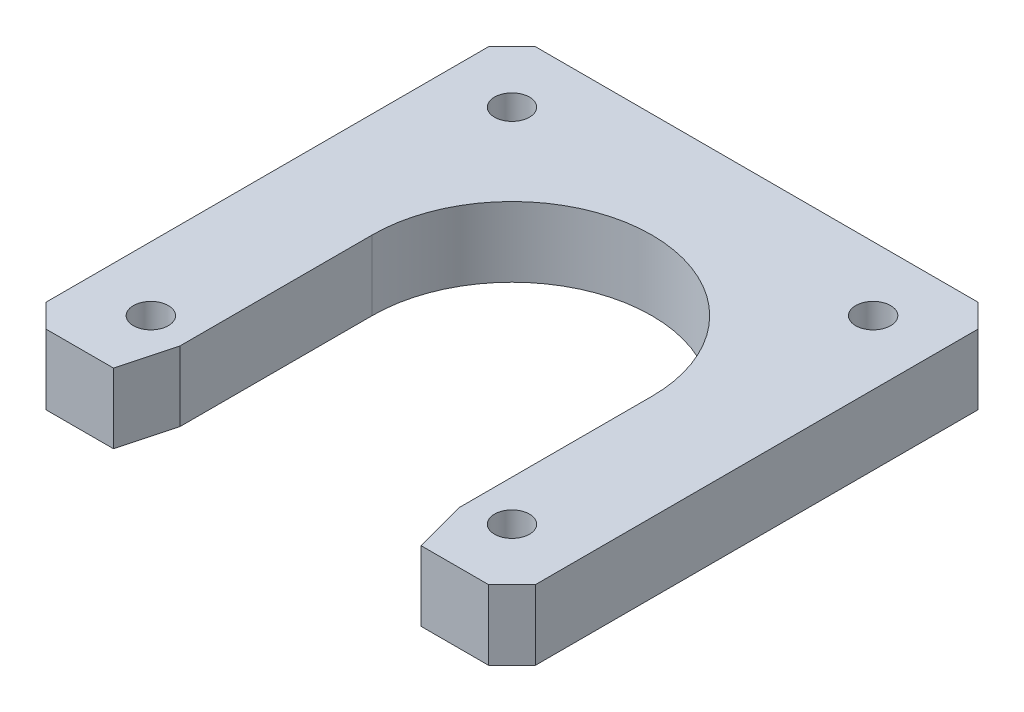
ISO-10303-21;
HEADER;
FILE_DESCRIPTION(('STEP AP214'),'2;1');
FILE_NAME('part.step','',(''),(''),'','','');
FILE_SCHEMA(('AUTOMOTIVE_DESIGN { 1 0 10303 214 1 1 1 1 }'));
ENDSEC;
DATA;
#1=APPLICATION_CONTEXT('core data for automotive mechanical design processes');
#2=APPLICATION_PROTOCOL_DEFINITION('international standard','automotive_design',2000,#1);
#3=PRODUCT_CONTEXT('',#1,'mechanical');
#4=PRODUCT('Part','Part','',(#3));
#5=PRODUCT_RELATED_PRODUCT_CATEGORY('part','',(#4));
#6=PRODUCT_DEFINITION_FORMATION('','',#4);
#7=PRODUCT_DEFINITION_CONTEXT('part definition',#1,'design');
#8=PRODUCT_DEFINITION('design','',#6,#7);
#9=PRODUCT_DEFINITION_SHAPE('','',#8);
#10=(LENGTH_UNIT() NAMED_UNIT(*) SI_UNIT(.MILLI.,.METRE.));
#11=(NAMED_UNIT(*) PLANE_ANGLE_UNIT() SI_UNIT($,.RADIAN.));
#12=(NAMED_UNIT(*) SI_UNIT($,.STERADIAN.) SOLID_ANGLE_UNIT());
#13=UNCERTAINTY_MEASURE_WITH_UNIT(LENGTH_MEASURE(1.E-05),#10,'distance_accuracy_value','');
#14=(GEOMETRIC_REPRESENTATION_CONTEXT(3) GLOBAL_UNCERTAINTY_ASSIGNED_CONTEXT((#13)) GLOBAL_UNIT_ASSIGNED_CONTEXT((#10,
#11,#12)) REPRESENTATION_CONTEXT('',''));
#15=CARTESIAN_POINT('',(0.,0.,0.));
#16=DIRECTION('',(0.,0.,1.));
#17=DIRECTION('',(1.,0.,0.));
#18=AXIS2_PLACEMENT_3D('',#15,#16,#17);
#19=CARTESIAN_POINT('',(-21.,6.,21.));
#20=DIRECTION('',(0.,0.,-1.));
#21=DIRECTION('',(-1.,0.,0.));
#22=AXIS2_PLACEMENT_3D('',#19,#20,#21);
#23=PLANE('',#22);
#24=DIRECTION('',(1.,0.,0.));
#25=VECTOR('',#24,1.);
#26=CARTESIAN_POINT('',(-21.,6.,21.));
#27=LINE('',#26,#25);
#28=CARTESIAN_POINT('',(13.20577136594,6.,21.));
#29=VERTEX_POINT('',#28);
#30=CARTESIAN_POINT('',(19.,6.,21.));
#31=VERTEX_POINT('',#30);
#32=EDGE_CURVE('E181',#29,#31,#27,.T.);
#33=ORIENTED_EDGE('',*,*,#32,.F.);
#34=DIRECTION('',(0.,-1.,0.));
#35=VECTOR('',#34,1.);
#36=CARTESIAN_POINT('',(13.2057713659401,6.,21.));
#37=LINE('',#36,#35);
#38=CARTESIAN_POINT('',(13.2057713659401,0.,21.));
#39=VERTEX_POINT('',#38);
#40=EDGE_CURVE('E239',#29,#39,#37,.T.);
#41=ORIENTED_EDGE('',*,*,#40,.T.);
#42=DIRECTION('',(1.,0.,0.));
#43=VECTOR('',#42,1.);
#44=CARTESIAN_POINT('',(-21.,0.,21.));
#45=LINE('',#44,#43);
#46=CARTESIAN_POINT('',(19.,0.,21.));
#47=VERTEX_POINT('',#46);
#48=EDGE_CURVE('E194',#39,#47,#45,.T.);
#49=ORIENTED_EDGE('',*,*,#48,.T.);
#50=DIRECTION('',(0.,1.,0.));
#51=VECTOR('',#50,1.);
#52=CARTESIAN_POINT('',(19.,6.,21.));
#53=LINE('',#52,#51);
#54=EDGE_CURVE('E230',#47,#31,#53,.T.);
#55=ORIENTED_EDGE('',*,*,#54,.T.);
#56=EDGE_LOOP('',(#33,#41,#49,#55));
#57=FACE_BOUND('',#56,.T.);
#58=ADVANCED_FACE('F34',(#57),#23,.F.);
#59=CARTESIAN_POINT('',(0.,6.,0.));
#60=DIRECTION('',(0.,-1.,0.));
#61=DIRECTION('',(0.,0.,-1.));
#62=AXIS2_PLACEMENT_3D('',#59,#60,#61);
#63=PLANE('',#62);
#64=DIRECTION('',(0.,0.,-1.));
#65=VECTOR('',#64,1.);
#66=CARTESIAN_POINT('',(12.,6.,21.));
#67=LINE('',#66,#65);
#68=CARTESIAN_POINT('',(12.,6.,16.4999999999999));
#69=VERTEX_POINT('',#68);
#70=CARTESIAN_POINT('',(12.,6.,0.));
#71=VERTEX_POINT('',#70);
#72=EDGE_CURVE('E153',#69,#71,#67,.T.);
#73=ORIENTED_EDGE('',*,*,#72,.F.);
#74=DIRECTION('',(-0.258819045102518,0.,-0.965925826289069));
#75=VECTOR('',#74,1.);
#76=CARTESIAN_POINT('',(12.,6.,16.4999999999999));
#77=LINE('',#76,#75);
#78=EDGE_CURVE('E237',#69,#29,#77,.F.);
#79=ORIENTED_EDGE('',*,*,#78,.T.);
#80=ORIENTED_EDGE('',*,*,#32,.T.);
#81=DIRECTION('',(-0.707106781186549,0.,0.707106781186546));
#82=VECTOR('',#81,1.);
#83=CARTESIAN_POINT('',(21.,6.,18.9999999999999));
#84=LINE('',#83,#82);
#85=CARTESIAN_POINT('',(21.,6.,18.9999999999999));
#86=VERTEX_POINT('',#85);
#87=EDGE_CURVE('E216',#31,#86,#84,.F.);
#88=ORIENTED_EDGE('',*,*,#87,.T.);
#89=DIRECTION('',(0.,0.,-1.));
#90=VECTOR('',#89,1.);
#91=CARTESIAN_POINT('',(21.,6.,21.));
#92=LINE('',#91,#90);
#93=CARTESIAN_POINT('',(21.,6.,-18.9999999999999));
#94=VERTEX_POINT('',#93);
#95=EDGE_CURVE('E171',#86,#94,#92,.T.);
#96=ORIENTED_EDGE('',*,*,#95,.T.);
#97=DIRECTION('',(0.707106781186546,0.,0.707106781186549));
#98=VECTOR('',#97,1.);
#99=CARTESIAN_POINT('',(19.,6.,-21.));
#100=LINE('',#99,#98);
#101=CARTESIAN_POINT('',(19.,6.,-21.));
#102=VERTEX_POINT('',#101);
#103=EDGE_CURVE('E218',#94,#102,#100,.F.);
#104=ORIENTED_EDGE('',*,*,#103,.T.);
#105=DIRECTION('',(-1.,0.,0.));
#106=VECTOR('',#105,1.);
#107=CARTESIAN_POINT('',(-21.,6.,-21.));
#108=LINE('',#107,#106);
#109=CARTESIAN_POINT('',(-19.,6.,-21.));
#110=VERTEX_POINT('',#109);
#111=EDGE_CURVE('E174',#102,#110,#108,.T.);
#112=ORIENTED_EDGE('',*,*,#111,.T.);
#113=DIRECTION('',(0.707106781186548,0.,-0.707106781186547));
#114=VECTOR('',#113,1.);
#115=CARTESIAN_POINT('',(-21.,6.,-19.));
#116=LINE('',#115,#114);
#117=CARTESIAN_POINT('',(-21.,6.,-19.));
#118=VERTEX_POINT('',#117);
#119=EDGE_CURVE('E220',#110,#118,#116,.F.);
#120=ORIENTED_EDGE('',*,*,#119,.T.);
#121=DIRECTION('',(0.,0.,1.));
#122=VECTOR('',#121,1.);
#123=CARTESIAN_POINT('',(-21.,6.,21.));
#124=LINE('',#123,#122);
#125=CARTESIAN_POINT('',(-21.,6.,18.9999999999999));
#126=VERTEX_POINT('',#125);
#127=EDGE_CURVE('E178',#118,#126,#124,.T.);
#128=ORIENTED_EDGE('',*,*,#127,.T.);
#129=DIRECTION('',(-0.707106781186546,0.,-0.707106781186549));
#130=VECTOR('',#129,1.);
#131=CARTESIAN_POINT('',(-19.,6.,21.));
#132=LINE('',#131,#130);
#133=CARTESIAN_POINT('',(-19.,6.,21.));
#134=VERTEX_POINT('',#133);
#135=EDGE_CURVE('E214',#126,#134,#132,.F.);
#136=ORIENTED_EDGE('',*,*,#135,.T.);
#137=CARTESIAN_POINT('',(-13.2057713659401,6.,21.));
#138=VERTEX_POINT('',#137);
#139=EDGE_CURVE('E182',#134,#138,#27,.T.);
#140=ORIENTED_EDGE('',*,*,#139,.T.);
#141=DIRECTION('',(-0.258819045102518,0.,0.965925826289069));
#142=VECTOR('',#141,1.);
#143=CARTESIAN_POINT('',(-13.2057713659401,6.,21.));
#144=LINE('',#143,#142);
#145=CARTESIAN_POINT('',(-12.,6.,16.4999999999999));
#146=VERTEX_POINT('',#145);
#147=EDGE_CURVE('E235',#138,#146,#144,.F.);
#148=ORIENTED_EDGE('',*,*,#147,.T.);
#149=DIRECTION('',(0.,0.,1.));
#150=VECTOR('',#149,1.);
#151=CARTESIAN_POINT('',(-12.,6.,0.));
#152=LINE('',#151,#150);
#153=CARTESIAN_POINT('',(-12.,6.,0.));
#154=VERTEX_POINT('',#153);
#155=EDGE_CURVE('E289',#154,#146,#152,.T.);
#156=ORIENTED_EDGE('',*,*,#155,.F.);
#157=CARTESIAN_POINT('',(0.,6.,0.));
#158=DIRECTION('',(0.,1.,0.));
#159=DIRECTION('',(0.,0.,1.));
#160=AXIS2_PLACEMENT_3D('',#157,#158,#159);
#161=CIRCLE('',#160,12.);
#162=EDGE_CURVE('E161',#71,#154,#161,.T.);
#163=ORIENTED_EDGE('',*,*,#162,.F.);
#164=EDGE_LOOP('',(#73,#79,#80,#88,#96,#104,#112,#120,#128,#136,#140,#148,#156,#163));
#165=FACE_BOUND('',#164,.T.);
#166=CARTESIAN_POINT('',(-15.5,6.,-15.5));
#167=DIRECTION('',(0.,1.,0.));
#168=DIRECTION('',(0.,0.,1.));
#169=AXIS2_PLACEMENT_3D('',#166,#167,#168);
#170=CIRCLE('',#169,1.5);
#171=CARTESIAN_POINT('',(-15.5,6.,-14.));
#172=VERTEX_POINT('',#171);
#173=EDGE_CURVE('E162',#172,#172,#170,.T.);
#174=ORIENTED_EDGE('',*,*,#173,.F.);
#175=EDGE_LOOP('',(#174));
#176=FACE_BOUND('',#175,.T.);
#177=CARTESIAN_POINT('',(15.5,6.,-15.5));
#178=DIRECTION('',(0.,1.,0.));
#179=DIRECTION('',(0.,0.,1.));
#180=AXIS2_PLACEMENT_3D('',#177,#178,#179);
#181=CIRCLE('',#180,1.5);
#182=CARTESIAN_POINT('',(15.5,6.,-14.));
#183=VERTEX_POINT('',#182);
#184=EDGE_CURVE('E307',#183,#183,#181,.T.);
#185=ORIENTED_EDGE('',*,*,#184,.F.);
#186=EDGE_LOOP('',(#185));
#187=FACE_BOUND('',#186,.T.);
#188=CARTESIAN_POINT('',(15.5,6.,15.5));
#189=DIRECTION('',(0.,1.,0.));
#190=DIRECTION('',(0.,0.,1.));
#191=AXIS2_PLACEMENT_3D('',#188,#189,#190);
#192=CIRCLE('',#191,1.5);
#193=CARTESIAN_POINT('',(15.5,6.,17.));
#194=VERTEX_POINT('',#193);
#195=EDGE_CURVE('E301',#194,#194,#192,.T.);
#196=ORIENTED_EDGE('',*,*,#195,.F.);
#197=EDGE_LOOP('',(#196));
#198=FACE_BOUND('',#197,.T.);
#199=CARTESIAN_POINT('',(-15.5,6.,15.5));
#200=DIRECTION('',(0.,1.,0.));
#201=DIRECTION('',(0.,0.,1.));
#202=AXIS2_PLACEMENT_3D('',#199,#200,#201);
#203=CIRCLE('',#202,1.5);
#204=CARTESIAN_POINT('',(-15.5,6.,17.));
#205=VERTEX_POINT('',#204);
#206=EDGE_CURVE('E295',#205,#205,#203,.T.);
#207=ORIENTED_EDGE('',*,*,#206,.F.);
#208=EDGE_LOOP('',(#207));
#209=FACE_BOUND('',#208,.T.);
#210=ADVANCED_FACE('F250',(#165,#176,#187,#198,#209),#63,.F.);
#211=CARTESIAN_POINT('',(0.,0.,0.));
#212=DIRECTION('',(0.,-1.,0.));
#213=DIRECTION('',(0.,0.,-1.));
#214=AXIS2_PLACEMENT_3D('',#211,#212,#213);
#215=PLANE('',#214);
#216=ORIENTED_EDGE('',*,*,#48,.F.);
#217=DIRECTION('',(0.258819045102518,0.,0.965925826289069));
#218=VECTOR('',#217,1.);
#219=CARTESIAN_POINT('',(7.07115242270671,0.,-1.89470958122162));
#220=LINE('',#219,#218);
#221=CARTESIAN_POINT('',(12.,0.,16.5));
#222=VERTEX_POINT('',#221);
#223=EDGE_CURVE('E142',#39,#222,#220,.F.);
#224=ORIENTED_EDGE('',*,*,#223,.T.);
#225=DIRECTION('',(0.,0.,-1.));
#226=VECTOR('',#225,1.);
#227=CARTESIAN_POINT('',(12.,0.,21.));
#228=LINE('',#227,#226);
#229=CARTESIAN_POINT('',(12.,0.,0.));
#230=VERTEX_POINT('',#229);
#231=EDGE_CURVE('E134',#222,#230,#228,.T.);
#232=ORIENTED_EDGE('',*,*,#231,.T.);
#233=CARTESIAN_POINT('',(0.,0.,0.));
#234=DIRECTION('',(0.,1.,0.));
#235=DIRECTION('',(0.,0.,1.));
#236=AXIS2_PLACEMENT_3D('',#233,#234,#235);
#237=CIRCLE('',#236,12.);
#238=CARTESIAN_POINT('',(-12.,0.,0.));
#239=VERTEX_POINT('',#238);
#240=EDGE_CURVE('E140',#230,#239,#237,.T.);
#241=ORIENTED_EDGE('',*,*,#240,.T.);
#242=DIRECTION('',(0.,0.,1.));
#243=VECTOR('',#242,1.);
#244=CARTESIAN_POINT('',(-12.,0.,0.));
#245=LINE('',#244,#243);
#246=CARTESIAN_POINT('',(-12.,0.,16.4999999999999));
#247=VERTEX_POINT('',#246);
#248=EDGE_CURVE('E147',#239,#247,#245,.T.);
#249=ORIENTED_EDGE('',*,*,#248,.T.);
#250=DIRECTION('',(0.258819045102518,0.,-0.965925826289069));
#251=VECTOR('',#250,1.);
#252=CARTESIAN_POINT('',(-7.07115242270671,0.,-1.89470958122162));
#253=LINE('',#252,#251);
#254=CARTESIAN_POINT('',(-13.2057713659401,0.,21.));
#255=VERTEX_POINT('',#254);
#256=EDGE_CURVE('E49',#247,#255,#253,.F.);
#257=ORIENTED_EDGE('',*,*,#256,.T.);
#258=CARTESIAN_POINT('',(-19.,0.,21.));
#259=VERTEX_POINT('',#258);
#260=EDGE_CURVE('E175',#259,#255,#45,.T.);
#261=ORIENTED_EDGE('',*,*,#260,.F.);
#262=DIRECTION('',(0.707106781186546,0.,0.707106781186549));
#263=VECTOR('',#262,1.);
#264=CARTESIAN_POINT('',(-20.,0.,19.9999999999999));
#265=LINE('',#264,#263);
#266=CARTESIAN_POINT('',(-21.,0.,18.9999999999999));
#267=VERTEX_POINT('',#266);
#268=EDGE_CURVE('E200',#259,#267,#265,.F.);
#269=ORIENTED_EDGE('',*,*,#268,.T.);
#270=DIRECTION('',(0.,0.,1.));
#271=VECTOR('',#270,1.);
#272=CARTESIAN_POINT('',(-21.,0.,21.));
#273=LINE('',#272,#271);
#274=CARTESIAN_POINT('',(-21.,0.,-19.));
#275=VERTEX_POINT('',#274);
#276=EDGE_CURVE('E191',#275,#267,#273,.T.);
#277=ORIENTED_EDGE('',*,*,#276,.F.);
#278=DIRECTION('',(-0.707106781186548,0.,0.707106781186547));
#279=VECTOR('',#278,1.);
#280=CARTESIAN_POINT('',(-20.,0.,-20.));
#281=LINE('',#280,#279);
#282=CARTESIAN_POINT('',(-19.,0.,-21.));
#283=VERTEX_POINT('',#282);
#284=EDGE_CURVE('E207',#275,#283,#281,.F.);
#285=ORIENTED_EDGE('',*,*,#284,.T.);
#286=DIRECTION('',(-1.,0.,0.));
#287=VECTOR('',#286,1.);
#288=CARTESIAN_POINT('',(-21.,0.,-21.));
#289=LINE('',#288,#287);
#290=CARTESIAN_POINT('',(19.,0.,-21.));
#291=VERTEX_POINT('',#290);
#292=EDGE_CURVE('E188',#291,#283,#289,.T.);
#293=ORIENTED_EDGE('',*,*,#292,.F.);
#294=DIRECTION('',(-0.707106781186546,0.,-0.707106781186549));
#295=VECTOR('',#294,1.);
#296=CARTESIAN_POINT('',(20.,0.,-20.));
#297=LINE('',#296,#295);
#298=CARTESIAN_POINT('',(21.,0.,-19.));
#299=VERTEX_POINT('',#298);
#300=EDGE_CURVE('E205',#291,#299,#297,.F.);
#301=ORIENTED_EDGE('',*,*,#300,.T.);
#302=DIRECTION('',(0.,0.,-1.));
#303=VECTOR('',#302,1.);
#304=CARTESIAN_POINT('',(21.,0.,21.));
#305=LINE('',#304,#303);
#306=CARTESIAN_POINT('',(21.,0.,19.));
#307=VERTEX_POINT('',#306);
#308=EDGE_CURVE('E164',#307,#299,#305,.T.);
#309=ORIENTED_EDGE('',*,*,#308,.F.);
#310=DIRECTION('',(0.707106781186549,0.,-0.707106781186546));
#311=VECTOR('',#310,1.);
#312=CARTESIAN_POINT('',(19.9999999999999,0.,20.));
#313=LINE('',#312,#311);
#314=EDGE_CURVE('E202',#307,#47,#313,.F.);
#315=ORIENTED_EDGE('',*,*,#314,.T.);
#316=EDGE_LOOP('',(#216,#224,#232,#241,#249,#257,#261,#269,#277,#285,#293,#301,#309,#315));
#317=FACE_BOUND('',#316,.T.);
#318=CARTESIAN_POINT('',(15.5,0.,15.5));
#319=DIRECTION('',(0.,1.,0.));
#320=DIRECTION('',(0.,0.,1.));
#321=AXIS2_PLACEMENT_3D('',#318,#319,#320);
#322=CIRCLE('',#321,1.5);
#323=CARTESIAN_POINT('',(15.5,0.,17.));
#324=VERTEX_POINT('',#323);
#325=EDGE_CURVE('E298',#324,#324,#322,.T.);
#326=ORIENTED_EDGE('',*,*,#325,.T.);
#327=EDGE_LOOP('',(#326));
#328=FACE_BOUND('',#327,.T.);
#329=CARTESIAN_POINT('',(-15.5,0.,-15.5));
#330=DIRECTION('',(0.,1.,0.));
#331=DIRECTION('',(0.,0.,1.));
#332=AXIS2_PLACEMENT_3D('',#329,#330,#331);
#333=CIRCLE('',#332,1.5);
#334=CARTESIAN_POINT('',(-15.5,0.,-14.));
#335=VERTEX_POINT('',#334);
#336=EDGE_CURVE('E167',#335,#335,#333,.T.);
#337=ORIENTED_EDGE('',*,*,#336,.T.);
#338=EDGE_LOOP('',(#337));
#339=FACE_BOUND('',#338,.T.);
#340=CARTESIAN_POINT('',(15.5,0.,-15.5));
#341=DIRECTION('',(0.,1.,0.));
#342=DIRECTION('',(0.,0.,1.));
#343=AXIS2_PLACEMENT_3D('',#340,#341,#342);
#344=CIRCLE('',#343,1.5);
#345=CARTESIAN_POINT('',(15.5,0.,-14.));
#346=VERTEX_POINT('',#345);
#347=EDGE_CURVE('E304',#346,#346,#344,.T.);
#348=ORIENTED_EDGE('',*,*,#347,.T.);
#349=EDGE_LOOP('',(#348));
#350=FACE_BOUND('',#349,.T.);
#351=CARTESIAN_POINT('',(-15.5,0.,15.5));
#352=DIRECTION('',(0.,1.,0.));
#353=DIRECTION('',(0.,0.,1.));
#354=AXIS2_PLACEMENT_3D('',#351,#352,#353);
#355=CIRCLE('',#354,1.5);
#356=CARTESIAN_POINT('',(-15.5,0.,17.));
#357=VERTEX_POINT('',#356);
#358=EDGE_CURVE('E157',#357,#357,#355,.T.);
#359=ORIENTED_EDGE('',*,*,#358,.T.);
#360=EDGE_LOOP('',(#359));
#361=FACE_BOUND('',#360,.T.);
#362=ADVANCED_FACE('F137',(#317,#328,#339,#350,#361),#215,.T.);
#363=CARTESIAN_POINT('',(21.,6.,21.));
#364=DIRECTION('',(-1.,0.,0.));
#365=DIRECTION('',(0.,0.,1.));
#366=AXIS2_PLACEMENT_3D('',#363,#364,#365);
#367=PLANE('',#366);
#368=ORIENTED_EDGE('',*,*,#308,.T.);
#369=DIRECTION('',(0.,1.,0.));
#370=VECTOR('',#369,1.);
#371=CARTESIAN_POINT('',(21.,6.,-19.));
#372=LINE('',#371,#370);
#373=EDGE_CURVE('E225',#299,#94,#372,.T.);
#374=ORIENTED_EDGE('',*,*,#373,.T.);
#375=ORIENTED_EDGE('',*,*,#95,.F.);
#376=DIRECTION('',(0.,-1.,0.));
#377=VECTOR('',#376,1.);
#378=CARTESIAN_POINT('',(21.,6.,18.9999999999999));
#379=LINE('',#378,#377);
#380=EDGE_CURVE('E222',#86,#307,#379,.T.);
#381=ORIENTED_EDGE('',*,*,#380,.T.);
#382=EDGE_LOOP('',(#368,#374,#375,#381));
#383=FACE_BOUND('',#382,.T.);
#384=ADVANCED_FACE('F277',(#383),#367,.F.);
#385=CARTESIAN_POINT('',(-21.,6.,-21.));
#386=DIRECTION('',(0.,0.,1.));
#387=DIRECTION('',(1.,0.,0.));
#388=AXIS2_PLACEMENT_3D('',#385,#386,#387);
#389=PLANE('',#388);
#390=ORIENTED_EDGE('',*,*,#292,.T.);
#391=DIRECTION('',(0.,1.,0.));
#392=VECTOR('',#391,1.);
#393=CARTESIAN_POINT('',(-19.,6.,-21.));
#394=LINE('',#393,#392);
#395=EDGE_CURVE('E212',#283,#110,#394,.T.);
#396=ORIENTED_EDGE('',*,*,#395,.T.);
#397=ORIENTED_EDGE('',*,*,#111,.F.);
#398=DIRECTION('',(0.,-1.,0.));
#399=VECTOR('',#398,1.);
#400=CARTESIAN_POINT('',(19.,6.,-21.));
#401=LINE('',#400,#399);
#402=EDGE_CURVE('E209',#102,#291,#401,.T.);
#403=ORIENTED_EDGE('',*,*,#402,.T.);
#404=EDGE_LOOP('',(#390,#396,#397,#403));
#405=FACE_BOUND('',#404,.T.);
#406=ADVANCED_FACE('F268',(#405),#389,.F.);
#407=CARTESIAN_POINT('',(-21.,6.,21.));
#408=DIRECTION('',(1.,0.,0.));
#409=DIRECTION('',(0.,0.,-1.));
#410=AXIS2_PLACEMENT_3D('',#407,#408,#409);
#411=PLANE('',#410);
#412=ORIENTED_EDGE('',*,*,#127,.F.);
#413=DIRECTION('',(0.,-1.,0.));
#414=VECTOR('',#413,1.);
#415=CARTESIAN_POINT('',(-21.,6.,-19.));
#416=LINE('',#415,#414);
#417=EDGE_CURVE('E197',#118,#275,#416,.T.);
#418=ORIENTED_EDGE('',*,*,#417,.T.);
#419=ORIENTED_EDGE('',*,*,#276,.T.);
#420=DIRECTION('',(0.,1.,0.));
#421=VECTOR('',#420,1.);
#422=CARTESIAN_POINT('',(-21.,6.,18.9999999999999));
#423=LINE('',#422,#421);
#424=EDGE_CURVE('E185',#267,#126,#423,.T.);
#425=ORIENTED_EDGE('',*,*,#424,.T.);
#426=EDGE_LOOP('',(#412,#418,#419,#425));
#427=FACE_BOUND('',#426,.T.);
#428=ADVANCED_FACE('F260',(#427),#411,.F.);
#429=ORIENTED_EDGE('',*,*,#260,.T.);
#430=DIRECTION('',(0.,1.,0.));
#431=VECTOR('',#430,1.);
#432=CARTESIAN_POINT('',(-13.2057713659401,6.,21.));
#433=LINE('',#432,#431);
#434=EDGE_CURVE('E42',#255,#138,#433,.T.);
#435=ORIENTED_EDGE('',*,*,#434,.T.);
#436=ORIENTED_EDGE('',*,*,#139,.F.);
#437=DIRECTION('',(0.,-1.,0.));
#438=VECTOR('',#437,1.);
#439=CARTESIAN_POINT('',(-19.,6.,21.));
#440=LINE('',#439,#438);
#441=EDGE_CURVE('E227',#134,#259,#440,.T.);
#442=ORIENTED_EDGE('',*,*,#441,.T.);
#443=EDGE_LOOP('',(#429,#435,#436,#442));
#444=FACE_BOUND('',#443,.T.);
#445=ADVANCED_FACE('F246',(#444),#23,.F.);
#446=CARTESIAN_POINT('',(0.,6.,0.));
#447=DIRECTION('',(0.,-1.,0.));
#448=DIRECTION('',(0.,0.,-1.));
#449=AXIS2_PLACEMENT_3D('',#446,#447,#448);
#450=CYLINDRICAL_SURFACE('',#449,12.);
#451=DIRECTION('',(0.,1.,0.));
#452=VECTOR('',#451,1.);
#453=CARTESIAN_POINT('',(12.,0.,0.));
#454=LINE('',#453,#452);
#455=EDGE_CURVE('E150',#230,#71,#454,.T.);
#456=ORIENTED_EDGE('',*,*,#455,.T.);
#457=ORIENTED_EDGE('',*,*,#162,.T.);
#458=DIRECTION('',(0.,1.,0.));
#459=VECTOR('',#458,1.);
#460=CARTESIAN_POINT('',(-12.,0.,0.));
#461=LINE('',#460,#459);
#462=EDGE_CURVE('E146',#239,#154,#461,.T.);
#463=ORIENTED_EDGE('',*,*,#462,.F.);
#464=ORIENTED_EDGE('',*,*,#240,.F.);
#465=EDGE_LOOP('',(#456,#457,#463,#464));
#466=FACE_BOUND('',#465,.T.);
#467=ADVANCED_FACE('F160',(#466),#450,.F.);
#468=CARTESIAN_POINT('',(-15.5,6.,-15.5));
#469=DIRECTION('',(0.,-1.,0.));
#470=DIRECTION('',(0.,0.,-1.));
#471=AXIS2_PLACEMENT_3D('',#468,#469,#470);
#472=CYLINDRICAL_SURFACE('',#471,1.5);
#473=ORIENTED_EDGE('',*,*,#173,.T.);
#474=EDGE_LOOP('',(#473));
#475=FACE_BOUND('',#474,.T.);
#476=ORIENTED_EDGE('',*,*,#336,.F.);
#477=EDGE_LOOP('',(#476));
#478=FACE_BOUND('',#477,.T.);
#479=ADVANCED_FACE('F316',(#475,#478),#472,.F.);
#480=CARTESIAN_POINT('',(15.5,6.,-15.5));
#481=DIRECTION('',(0.,-1.,0.));
#482=DIRECTION('',(0.,0.,-1.));
#483=AXIS2_PLACEMENT_3D('',#480,#481,#482);
#484=CYLINDRICAL_SURFACE('',#483,1.5);
#485=ORIENTED_EDGE('',*,*,#184,.T.);
#486=EDGE_LOOP('',(#485));
#487=FACE_BOUND('',#486,.T.);
#488=ORIENTED_EDGE('',*,*,#347,.F.);
#489=EDGE_LOOP('',(#488));
#490=FACE_BOUND('',#489,.T.);
#491=ADVANCED_FACE('F318',(#487,#490),#484,.F.);
#492=CARTESIAN_POINT('',(15.5,6.,15.5));
#493=DIRECTION('',(0.,-1.,0.));
#494=DIRECTION('',(0.,0.,-1.));
#495=AXIS2_PLACEMENT_3D('',#492,#493,#494);
#496=CYLINDRICAL_SURFACE('',#495,1.5);
#497=ORIENTED_EDGE('',*,*,#195,.T.);
#498=EDGE_LOOP('',(#497));
#499=FACE_BOUND('',#498,.T.);
#500=ORIENTED_EDGE('',*,*,#325,.F.);
#501=EDGE_LOOP('',(#500));
#502=FACE_BOUND('',#501,.T.);
#503=ADVANCED_FACE('F325',(#499,#502),#496,.F.);
#504=CARTESIAN_POINT('',(-15.5,6.,15.5));
#505=DIRECTION('',(0.,-1.,0.));
#506=DIRECTION('',(0.,0.,-1.));
#507=AXIS2_PLACEMENT_3D('',#504,#505,#506);
#508=CYLINDRICAL_SURFACE('',#507,1.5);
#509=ORIENTED_EDGE('',*,*,#206,.T.);
#510=EDGE_LOOP('',(#509));
#511=FACE_BOUND('',#510,.T.);
#512=ORIENTED_EDGE('',*,*,#358,.F.);
#513=EDGE_LOOP('',(#512));
#514=FACE_BOUND('',#513,.T.);
#515=ADVANCED_FACE('F350',(#511,#514),#508,.F.);
#516=CARTESIAN_POINT('',(-21.,6.,-19.));
#517=DIRECTION('',(0.707106781186547,0.,0.707106781186548));
#518=DIRECTION('',(0.,-1.,0.));
#519=AXIS2_PLACEMENT_3D('',#516,#517,#518);
#520=PLANE('',#519);
#521=ORIENTED_EDGE('',*,*,#119,.F.);
#522=ORIENTED_EDGE('',*,*,#395,.F.);
#523=ORIENTED_EDGE('',*,*,#284,.F.);
#524=ORIENTED_EDGE('',*,*,#417,.F.);
#525=EDGE_LOOP('',(#521,#522,#523,#524));
#526=FACE_BOUND('',#525,.T.);
#527=ADVANCED_FACE('F264',(#526),#520,.F.);
#528=CARTESIAN_POINT('',(19.,6.,-21.));
#529=DIRECTION('',(-0.707106781186549,0.,0.707106781186546));
#530=DIRECTION('',(0.,-1.,0.));
#531=AXIS2_PLACEMENT_3D('',#528,#529,#530);
#532=PLANE('',#531);
#533=ORIENTED_EDGE('',*,*,#103,.F.);
#534=ORIENTED_EDGE('',*,*,#373,.F.);
#535=ORIENTED_EDGE('',*,*,#300,.F.);
#536=ORIENTED_EDGE('',*,*,#402,.F.);
#537=EDGE_LOOP('',(#533,#534,#535,#536));
#538=FACE_BOUND('',#537,.T.);
#539=ADVANCED_FACE('F273',(#538),#532,.F.);
#540=CARTESIAN_POINT('',(21.,6.,18.9999999999999));
#541=DIRECTION('',(-0.707106781186546,0.,-0.707106781186549));
#542=DIRECTION('',(0.,-1.,0.));
#543=AXIS2_PLACEMENT_3D('',#540,#541,#542);
#544=PLANE('',#543);
#545=ORIENTED_EDGE('',*,*,#87,.F.);
#546=ORIENTED_EDGE('',*,*,#54,.F.);
#547=ORIENTED_EDGE('',*,*,#314,.F.);
#548=ORIENTED_EDGE('',*,*,#380,.F.);
#549=EDGE_LOOP('',(#545,#546,#547,#548));
#550=FACE_BOUND('',#549,.T.);
#551=ADVANCED_FACE('F282',(#550),#544,.F.);
#552=CARTESIAN_POINT('',(-19.,6.,21.));
#553=DIRECTION('',(0.707106781186549,0.,-0.707106781186546));
#554=DIRECTION('',(0.,-1.,0.));
#555=AXIS2_PLACEMENT_3D('',#552,#553,#554);
#556=PLANE('',#555);
#557=ORIENTED_EDGE('',*,*,#135,.F.);
#558=ORIENTED_EDGE('',*,*,#424,.F.);
#559=ORIENTED_EDGE('',*,*,#268,.F.);
#560=ORIENTED_EDGE('',*,*,#441,.F.);
#561=EDGE_LOOP('',(#557,#558,#559,#560));
#562=FACE_BOUND('',#561,.T.);
#563=ADVANCED_FACE('F257',(#562),#556,.F.);
#564=CARTESIAN_POINT('',(-12.,0.,0.));
#565=DIRECTION('',(-1.,0.,0.));
#566=DIRECTION('',(0.,0.,1.));
#567=AXIS2_PLACEMENT_3D('',#564,#565,#566);
#568=PLANE('',#567);
#569=ORIENTED_EDGE('',*,*,#155,.T.);
#570=DIRECTION('',(0.,-1.,0.));
#571=VECTOR('',#570,1.);
#572=CARTESIAN_POINT('',(-12.,0.,16.4999999999999));
#573=LINE('',#572,#571);
#574=EDGE_CURVE('E11',#146,#247,#573,.T.);
#575=ORIENTED_EDGE('',*,*,#574,.T.);
#576=ORIENTED_EDGE('',*,*,#248,.F.);
#577=ORIENTED_EDGE('',*,*,#462,.T.);
#578=EDGE_LOOP('',(#569,#575,#576,#577));
#579=FACE_BOUND('',#578,.T.);
#580=ADVANCED_FACE('F356',(#579),#568,.F.);
#581=CARTESIAN_POINT('',(12.,0.,21.));
#582=DIRECTION('',(1.,0.,0.));
#583=DIRECTION('',(0.,0.,-1.));
#584=AXIS2_PLACEMENT_3D('',#581,#582,#583);
#585=PLANE('',#584);
#586=ORIENTED_EDGE('',*,*,#231,.F.);
#587=DIRECTION('',(0.,1.,0.));
#588=VECTOR('',#587,1.);
#589=CARTESIAN_POINT('',(12.,0.,16.4999999999999));
#590=LINE('',#589,#588);
#591=EDGE_CURVE('E233',#222,#69,#590,.T.);
#592=ORIENTED_EDGE('',*,*,#591,.T.);
#593=ORIENTED_EDGE('',*,*,#72,.T.);
#594=ORIENTED_EDGE('',*,*,#455,.F.);
#595=EDGE_LOOP('',(#586,#592,#593,#594));
#596=FACE_BOUND('',#595,.T.);
#597=ADVANCED_FACE('F151',(#596),#585,.F.);
#598=CARTESIAN_POINT('',(12.,0.,16.4999999999999));
#599=DIRECTION('',(0.965925826289069,0.,-0.258819045102518));
#600=DIRECTION('',(0.,1.,0.));
#601=AXIS2_PLACEMENT_3D('',#598,#599,#600);
#602=PLANE('',#601);
#603=ORIENTED_EDGE('',*,*,#223,.F.);
#604=ORIENTED_EDGE('',*,*,#40,.F.);
#605=ORIENTED_EDGE('',*,*,#78,.F.);
#606=ORIENTED_EDGE('',*,*,#591,.F.);
#607=EDGE_LOOP('',(#603,#604,#605,#606));
#608=FACE_BOUND('',#607,.T.);
#609=ADVANCED_FACE('F287',(#608),#602,.F.);
#610=CARTESIAN_POINT('',(-13.2057713659401,6.,21.));
#611=DIRECTION('',(-0.965925826289069,0.,-0.258819045102518));
#612=DIRECTION('',(0.,1.,0.));
#613=AXIS2_PLACEMENT_3D('',#610,#611,#612);
#614=PLANE('',#613);
#615=ORIENTED_EDGE('',*,*,#256,.F.);
#616=ORIENTED_EDGE('',*,*,#574,.F.);
#617=ORIENTED_EDGE('',*,*,#147,.F.);
#618=ORIENTED_EDGE('',*,*,#434,.F.);
#619=EDGE_LOOP('',(#615,#616,#617,#618));
#620=FACE_BOUND('',#619,.T.);
#621=ADVANCED_FACE('F36',(#620),#614,.F.);
#622=CLOSED_SHELL('',(#58,#210,#362,#384,#406,#428,#445,#467,#479,#491,#503,#515,#527,#539,#551,
#563,#580,#597,#609,#621));
#623=MANIFOLD_SOLID_BREP('B2',#622);
#624=ADVANCED_BREP_SHAPE_REPRESENTATION('',(#18,#623),#14);
#625=SHAPE_DEFINITION_REPRESENTATION(#9,#624);
ENDSEC;
END-ISO-10303-21;
